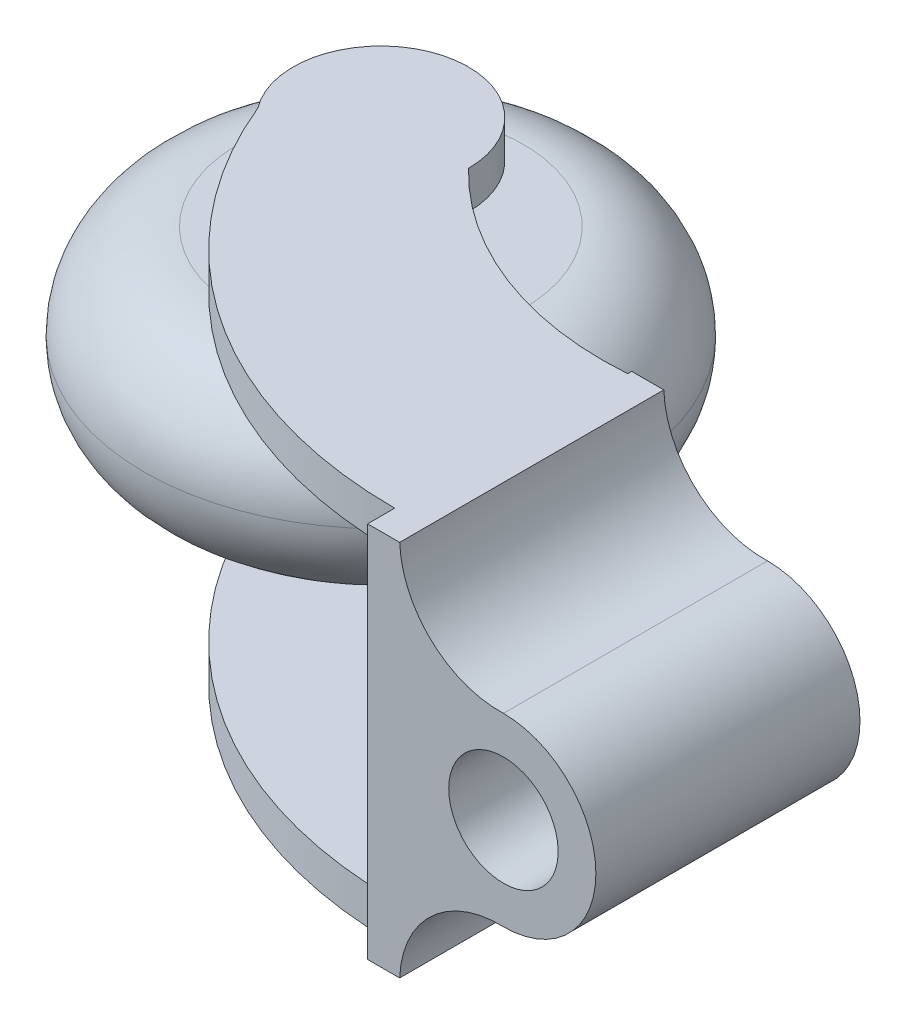
ISO-10303-21;
HEADER;
FILE_DESCRIPTION(('STEP AP214'),'2;1');
FILE_NAME('part.step','',(''),(''),'','','');
FILE_SCHEMA(('AUTOMOTIVE_DESIGN { 1 0 10303 214 1 1 1 1 }'));
ENDSEC;
DATA;
#1=APPLICATION_CONTEXT('core data for automotive mechanical design processes');
#2=APPLICATION_PROTOCOL_DEFINITION('international standard','automotive_design',2000,#1);
#3=PRODUCT_CONTEXT('',#1,'mechanical');
#4=PRODUCT('Part','Part','',(#3));
#5=PRODUCT_RELATED_PRODUCT_CATEGORY('part','',(#4));
#6=PRODUCT_DEFINITION_FORMATION('','',#4);
#7=PRODUCT_DEFINITION_CONTEXT('part definition',#1,'design');
#8=PRODUCT_DEFINITION('design','',#6,#7);
#9=PRODUCT_DEFINITION_SHAPE('','',#8);
#10=(LENGTH_UNIT() NAMED_UNIT(*) SI_UNIT(.MILLI.,.METRE.));
#11=(NAMED_UNIT(*) PLANE_ANGLE_UNIT() SI_UNIT($,.RADIAN.));
#12=(NAMED_UNIT(*) SI_UNIT($,.STERADIAN.) SOLID_ANGLE_UNIT());
#13=UNCERTAINTY_MEASURE_WITH_UNIT(LENGTH_MEASURE(1.E-05),#10,'distance_accuracy_value','');
#14=(GEOMETRIC_REPRESENTATION_CONTEXT(3) GLOBAL_UNCERTAINTY_ASSIGNED_CONTEXT((#13)) GLOBAL_UNIT_ASSIGNED_CONTEXT((#10,
#11,#12)) REPRESENTATION_CONTEXT('',''));
#15=CARTESIAN_POINT('',(0.,0.,0.));
#16=DIRECTION('',(0.,0.,1.));
#17=DIRECTION('',(1.,0.,0.));
#18=AXIS2_PLACEMENT_3D('',#15,#16,#17);
#19=CARTESIAN_POINT('',(0.,15.,0.));
#20=DIRECTION('',(0.,-1.,0.));
#21=DIRECTION('',(0.,0.,-1.));
#22=AXIS2_PLACEMENT_3D('',#19,#20,#21);
#23=CYLINDRICAL_SURFACE('',#22,1.925);
#24=CARTESIAN_POINT('',(0.,0.,0.));
#25=DIRECTION('',(0.,1.,0.));
#26=DIRECTION('',(0.,0.,1.));
#27=AXIS2_PLACEMENT_3D('',#24,#25,#26);
#28=CIRCLE('',#27,1.925);
#29=CARTESIAN_POINT('',(0.,0.,1.925));
#30=VERTEX_POINT('',#29);
#31=EDGE_CURVE('E316',#30,#30,#28,.T.);
#32=ORIENTED_EDGE('',*,*,#31,.F.);
#33=EDGE_LOOP('',(#32));
#34=FACE_BOUND('',#33,.T.);
#35=CARTESIAN_POINT('',(0.,-3.,0.));
#36=DIRECTION('',(0.,-1.,0.));
#37=DIRECTION('',(0.,0.,-1.));
#38=AXIS2_PLACEMENT_3D('',#35,#36,#37);
#39=CIRCLE('',#38,1.925);
#40=CARTESIAN_POINT('',(0.,-3.,-1.925));
#41=VERTEX_POINT('',#40);
#42=EDGE_CURVE('E315',#41,#41,#39,.F.);
#43=ORIENTED_EDGE('',*,*,#42,.T.);
#44=EDGE_LOOP('',(#43));
#45=FACE_BOUND('',#44,.T.);
#46=ADVANCED_FACE('F89',(#34,#45),#23,.T.);
#47=CARTESIAN_POINT('',(0.,10.,0.));
#48=DIRECTION('',(0.,1.,0.));
#49=DIRECTION('',(0.,0.,1.));
#50=AXIS2_PLACEMENT_3D('',#47,#48,#49);
#51=PLANE('',#50);
#52=CARTESIAN_POINT('',(0.,10.,0.));
#53=DIRECTION('',(0.,1.,0.));
#54=DIRECTION('',(0.,0.,1.));
#55=AXIS2_PLACEMENT_3D('',#52,#53,#54);
#56=CIRCLE('',#55,7.55);
#57=CARTESIAN_POINT('',(0.,10.,7.55));
#58=VERTEX_POINT('',#57);
#59=EDGE_CURVE('E97',#58,#58,#56,.T.);
#60=ORIENTED_EDGE('',*,*,#59,.T.);
#61=EDGE_LOOP('',(#60));
#62=FACE_BOUND('',#61,.T.);
#63=CARTESIAN_POINT('',(0.,10.,0.));
#64=DIRECTION('',(0.,1.,0.));
#65=DIRECTION('',(0.,0.,1.));
#66=AXIS2_PLACEMENT_3D('',#63,#64,#65);
#67=CIRCLE('',#66,1.925);
#68=CARTESIAN_POINT('',(0.,10.,1.925));
#69=VERTEX_POINT('',#68);
#70=EDGE_CURVE('E320',#69,#69,#67,.T.);
#71=ORIENTED_EDGE('',*,*,#70,.F.);
#72=EDGE_LOOP('',(#71));
#73=FACE_BOUND('',#72,.T.);
#74=ADVANCED_FACE('F390',(#62,#73),#51,.T.);
#75=CARTESIAN_POINT('',(0.,0.,0.));
#76=DIRECTION('',(0.,1.,0.));
#77=DIRECTION('',(0.,0.,1.));
#78=AXIS2_PLACEMENT_3D('',#75,#76,#77);
#79=PLANE('',#78);
#80=CARTESIAN_POINT('',(0.,0.,0.));
#81=DIRECTION('',(0.,1.,0.));
#82=DIRECTION('',(0.,0.,1.));
#83=AXIS2_PLACEMENT_3D('',#80,#81,#82);
#84=CIRCLE('',#83,7.55);
#85=CARTESIAN_POINT('',(0.,0.,7.55));
#86=VERTEX_POINT('',#85);
#87=EDGE_CURVE('E323',#86,#86,#84,.F.);
#88=ORIENTED_EDGE('',*,*,#87,.T.);
#89=EDGE_LOOP('',(#88));
#90=FACE_BOUND('',#89,.T.);
#91=ORIENTED_EDGE('',*,*,#31,.T.);
#92=EDGE_LOOP('',(#91));
#93=FACE_BOUND('',#92,.T.);
#94=ADVANCED_FACE('F397',(#90,#93),#79,.F.);
#95=CARTESIAN_POINT('',(0.,5.,0.));
#96=DIRECTION('',(0.,1.,0.));
#97=DIRECTION('',(0.,0.,1.));
#98=AXIS2_PLACEMENT_3D('',#95,#96,#97);
#99=TOROIDAL_SURFACE('',#98,7.55,5.);
#100=ORIENTED_EDGE('',*,*,#59,.F.);
#101=EDGE_LOOP('',(#100));
#102=FACE_BOUND('',#101,.T.);
#103=CARTESIAN_POINT('',(0.,5.,0.));
#104=DIRECTION('',(0.,1.,0.));
#105=DIRECTION('',(0.,0.,1.));
#106=AXIS2_PLACEMENT_3D('',#103,#104,#105);
#107=CIRCLE('',#106,12.55);
#108=CARTESIAN_POINT('',(0.,5.,12.55));
#109=VERTEX_POINT('',#108);
#110=EDGE_CURVE('E319',#109,#109,#107,.F.);
#111=ORIENTED_EDGE('',*,*,#110,.F.);
#112=EDGE_LOOP('',(#111));
#113=FACE_BOUND('',#112,.T.);
#114=ADVANCED_FACE('F91',(#102,#113),#99,.T.);
#115=CARTESIAN_POINT('',(0.,5.,0.));
#116=DIRECTION('',(0.,1.,0.));
#117=DIRECTION('',(0.,0.,1.));
#118=AXIS2_PLACEMENT_3D('',#115,#116,#117);
#119=TOROIDAL_SURFACE('',#118,7.55,5.);
#120=ORIENTED_EDGE('',*,*,#87,.F.);
#121=EDGE_LOOP('',(#120));
#122=FACE_BOUND('',#121,.T.);
#123=ORIENTED_EDGE('',*,*,#110,.T.);
#124=EDGE_LOOP('',(#123));
#125=FACE_BOUND('',#124,.T.);
#126=ADVANCED_FACE('F403',(#122,#125),#119,.T.);
#127=CARTESIAN_POINT('',(0.,13.,0.));
#128=DIRECTION('',(0.,-1.,0.));
#129=DIRECTION('',(0.,0.,-1.));
#130=AXIS2_PLACEMENT_3D('',#127,#128,#129);
#131=CIRCLE('',#130,1.925);
#132=CARTESIAN_POINT('',(0.,13.,-1.925));
#133=VERTEX_POINT('',#132);
#134=EDGE_CURVE('E12',#133,#133,#131,.F.);
#135=ORIENTED_EDGE('',*,*,#134,.F.);
#136=EDGE_LOOP('',(#135));
#137=FACE_BOUND('',#136,.T.);
#138=ORIENTED_EDGE('',*,*,#70,.T.);
#139=EDGE_LOOP('',(#138));
#140=FACE_BOUND('',#139,.T.);
#141=ADVANCED_FACE('F393',(#137,#140),#23,.T.);
#142=CARTESIAN_POINT('',(0.,-3.,0.));
#143=DIRECTION('',(0.,-1.,0.));
#144=DIRECTION('',(0.,0.,-1.));
#145=AXIS2_PLACEMENT_3D('',#142,#143,#144);
#146=CYLINDRICAL_SURFACE('',#145,4.65);
#147=CARTESIAN_POINT('',(0.,-5.,0.));
#148=DIRECTION('',(0.,-1.,0.));
#149=DIRECTION('',(0.,0.,-1.));
#150=AXIS2_PLACEMENT_3D('',#147,#148,#149);
#151=CIRCLE('',#150,4.65);
#152=CARTESIAN_POINT('',(-3.69653807580867,-5.,2.82101156575025));
#153=VERTEX_POINT('',#152);
#154=CARTESIAN_POINT('',(4.65,-5.,0.));
#155=VERTEX_POINT('',#154);
#156=EDGE_CURVE('E308',#153,#155,#151,.T.);
#157=ORIENTED_EDGE('',*,*,#156,.F.);
#158=DIRECTION('',(0.,-1.,0.));
#159=VECTOR('',#158,1.);
#160=CARTESIAN_POINT('',(-3.69653807580868,-4.,2.82101156575025));
#161=LINE('',#160,#159);
#162=CARTESIAN_POINT('',(-3.69653807580867,-3.,2.82101156575025));
#163=VERTEX_POINT('',#162);
#164=EDGE_CURVE('E313',#163,#153,#161,.T.);
#165=ORIENTED_EDGE('',*,*,#164,.F.);
#166=CARTESIAN_POINT('',(0.,-3.,0.));
#167=DIRECTION('',(0.,-1.,0.));
#168=DIRECTION('',(0.,0.,-1.));
#169=AXIS2_PLACEMENT_3D('',#166,#167,#168);
#170=CIRCLE('',#169,4.65);
#171=CARTESIAN_POINT('',(4.65,-3.,0.));
#172=VERTEX_POINT('',#171);
#173=EDGE_CURVE('E300',#163,#172,#170,.T.);
#174=ORIENTED_EDGE('',*,*,#173,.T.);
#175=DIRECTION('',(0.,-1.,0.));
#176=VECTOR('',#175,1.);
#177=CARTESIAN_POINT('',(4.65,-3.,0.));
#178=LINE('',#177,#176);
#179=EDGE_CURVE('E306',#172,#155,#178,.T.);
#180=ORIENTED_EDGE('',*,*,#179,.T.);
#181=EDGE_LOOP('',(#157,#165,#174,#180));
#182=FACE_BOUND('',#181,.T.);
#183=ADVANCED_FACE('F346',(#182),#146,.T.);
#184=CARTESIAN_POINT('',(18.2711085103425,-3.,-6.17537570171098));
#185=DIRECTION('',(0.,-1.,0.));
#186=DIRECTION('',(0.,0.,-1.));
#187=AXIS2_PLACEMENT_3D('',#184,#185,#186);
#188=CYLINDRICAL_SURFACE('',#187,23.7384178158566);
#189=CARTESIAN_POINT('',(18.2711085103425,-5.,-6.17537570171098));
#190=DIRECTION('',(0.,-1.,0.));
#191=DIRECTION('',(0.,0.,-1.));
#192=AXIS2_PLACEMENT_3D('',#189,#190,#191);
#193=CIRCLE('',#192,23.7384178158566);
#194=CARTESIAN_POINT('',(18.3,-5.,17.5630245325509));
#195=VERTEX_POINT('',#194);
#196=EDGE_CURVE('E111',#153,#195,#193,.F.);
#197=ORIENTED_EDGE('',*,*,#196,.T.);
#198=DIRECTION('',(0.,-1.,0.));
#199=VECTOR('',#198,1.);
#200=CARTESIAN_POINT('',(18.3,-3.,17.5630245325509));
#201=LINE('',#200,#199);
#202=CARTESIAN_POINT('',(18.3,-3.,17.5630245325509));
#203=VERTEX_POINT('',#202);
#204=EDGE_CURVE('E255',#195,#203,#201,.F.);
#205=ORIENTED_EDGE('',*,*,#204,.T.);
#206=CARTESIAN_POINT('',(18.2711085103425,-3.,-6.17537570171098));
#207=DIRECTION('',(0.,-1.,0.));
#208=DIRECTION('',(0.,0.,-1.));
#209=AXIS2_PLACEMENT_3D('',#206,#207,#208);
#210=CIRCLE('',#209,23.7384178158566);
#211=EDGE_CURVE('E203',#163,#203,#210,.F.);
#212=ORIENTED_EDGE('',*,*,#211,.F.);
#213=ORIENTED_EDGE('',*,*,#164,.T.);
#214=EDGE_LOOP('',(#197,#205,#212,#213));
#215=FACE_BOUND('',#214,.T.);
#216=ADVANCED_FACE('F341',(#215),#188,.T.);
#217=CARTESIAN_POINT('',(17.0198338011086,-3.,-11.9131397694033));
#218=DIRECTION('',(0.,-1.,0.));
#219=DIRECTION('',(0.,0.,-1.));
#220=AXIS2_PLACEMENT_3D('',#217,#218,#219);
#221=CYLINDRICAL_SURFACE('',#220,17.1736917240408);
#222=DIRECTION('',(0.,-1.,0.));
#223=VECTOR('',#222,1.);
#224=CARTESIAN_POINT('',(18.3,-3.,5.2127722336289));
#225=LINE('',#224,#223);
#226=CARTESIAN_POINT('',(18.3,-5.,5.2127722336289));
#227=VERTEX_POINT('',#226);
#228=CARTESIAN_POINT('',(18.3,-3.,5.2127722336289));
#229=VERTEX_POINT('',#228);
#230=EDGE_CURVE('E273',#227,#229,#225,.F.);
#231=ORIENTED_EDGE('',*,*,#230,.F.);
#232=CARTESIAN_POINT('',(17.0198338011086,-5.,-11.9131397694033));
#233=DIRECTION('',(0.,-1.,0.));
#234=DIRECTION('',(0.,0.,-1.));
#235=AXIS2_PLACEMENT_3D('',#232,#233,#234);
#236=CIRCLE('',#235,17.1736917240408);
#237=EDGE_CURVE('E204',#155,#227,#236,.F.);
#238=ORIENTED_EDGE('',*,*,#237,.F.);
#239=ORIENTED_EDGE('',*,*,#179,.F.);
#240=CARTESIAN_POINT('',(17.0198338011086,-3.,-11.9131397694033));
#241=DIRECTION('',(0.,-1.,0.));
#242=DIRECTION('',(0.,0.,-1.));
#243=AXIS2_PLACEMENT_3D('',#240,#241,#242);
#244=CIRCLE('',#243,17.1736917240408);
#245=EDGE_CURVE('E303',#172,#229,#244,.F.);
#246=ORIENTED_EDGE('',*,*,#245,.T.);
#247=EDGE_LOOP('',(#231,#238,#239,#246));
#248=FACE_BOUND('',#247,.T.);
#249=ADVANCED_FACE('F336',(#248),#221,.F.);
#250=CARTESIAN_POINT('',(0.,-3.,0.));
#251=DIRECTION('',(0.,-1.,0.));
#252=DIRECTION('',(0.,0.,-1.));
#253=AXIS2_PLACEMENT_3D('',#250,#251,#252);
#254=PLANE('',#253);
#255=ORIENTED_EDGE('',*,*,#42,.F.);
#256=EDGE_LOOP('',(#255));
#257=FACE_BOUND('',#256,.T.);
#258=ORIENTED_EDGE('',*,*,#211,.T.);
#259=DIRECTION('',(0.,0.,-1.));
#260=VECTOR('',#259,1.);
#261=CARTESIAN_POINT('',(18.3,-3.,0.));
#262=LINE('',#261,#260);
#263=EDGE_CURVE('E104',#203,#229,#262,.T.);
#264=ORIENTED_EDGE('',*,*,#263,.T.);
#265=ORIENTED_EDGE('',*,*,#245,.F.);
#266=ORIENTED_EDGE('',*,*,#173,.F.);
#267=EDGE_LOOP('',(#258,#264,#265,#266));
#268=FACE_BOUND('',#267,.T.);
#269=ADVANCED_FACE('F333',(#257,#268),#254,.F.);
#270=CARTESIAN_POINT('',(0.,-5.,0.));
#271=DIRECTION('',(0.,-1.,0.));
#272=DIRECTION('',(0.,0.,-1.));
#273=AXIS2_PLACEMENT_3D('',#270,#271,#272);
#274=PLANE('',#273);
#275=ORIENTED_EDGE('',*,*,#237,.T.);
#276=DIRECTION('',(0.,0.,-1.));
#277=VECTOR('',#276,1.);
#278=CARTESIAN_POINT('',(18.3,-5.,17.5));
#279=LINE('',#278,#277);
#280=CARTESIAN_POINT('',(18.3,-5.,5.));
#281=VERTEX_POINT('',#280);
#282=EDGE_CURVE('E257',#227,#281,#279,.T.);
#283=ORIENTED_EDGE('',*,*,#282,.T.);
#284=DIRECTION('',(1.,0.,0.));
#285=VECTOR('',#284,1.);
#286=CARTESIAN_POINT('',(18.3,-5.,5.));
#287=LINE('',#286,#285);
#288=CARTESIAN_POINT('',(20.,-5.,5.));
#289=VERTEX_POINT('',#288);
#290=EDGE_CURVE('E199',#281,#289,#287,.T.);
#291=ORIENTED_EDGE('',*,*,#290,.T.);
#292=DIRECTION('',(0.,0.,-1.));
#293=VECTOR('',#292,1.);
#294=CARTESIAN_POINT('',(20.,-5.,0.));
#295=LINE('',#294,#293);
#296=CARTESIAN_POINT('',(20.,-5.,19.));
#297=VERTEX_POINT('',#296);
#298=EDGE_CURVE('E191',#297,#289,#295,.T.);
#299=ORIENTED_EDGE('',*,*,#298,.F.);
#300=DIRECTION('',(-1.,0.,0.));
#301=VECTOR('',#300,1.);
#302=CARTESIAN_POINT('',(0.,-5.,19.));
#303=LINE('',#302,#301);
#304=CARTESIAN_POINT('',(18.3,-5.,19.));
#305=VERTEX_POINT('',#304);
#306=EDGE_CURVE('E197',#297,#305,#303,.T.);
#307=ORIENTED_EDGE('',*,*,#306,.T.);
#308=DIRECTION('',(0.,0.,-1.));
#309=VECTOR('',#308,1.);
#310=CARTESIAN_POINT('',(18.3,-5.,19.));
#311=LINE('',#310,#309);
#312=EDGE_CURVE('E235',#305,#195,#311,.T.);
#313=ORIENTED_EDGE('',*,*,#312,.T.);
#314=ORIENTED_EDGE('',*,*,#196,.F.);
#315=ORIENTED_EDGE('',*,*,#156,.T.);
#316=EDGE_LOOP('',(#275,#283,#291,#299,#307,#313,#314,#315));
#317=FACE_BOUND('',#316,.T.);
#318=ADVANCED_FACE('F194',(#317),#274,.T.);
#319=CARTESIAN_POINT('',(0.,13.,0.));
#320=DIRECTION('',(0.,1.,0.));
#321=DIRECTION('',(0.,0.,1.));
#322=AXIS2_PLACEMENT_3D('',#319,#320,#321);
#323=CYLINDRICAL_SURFACE('',#322,4.65);
#324=CARTESIAN_POINT('',(0.,15.,0.));
#325=DIRECTION('',(0.,-1.,0.));
#326=DIRECTION('',(0.,0.,-1.));
#327=AXIS2_PLACEMENT_3D('',#324,#325,#326);
#328=CIRCLE('',#327,4.65);
#329=CARTESIAN_POINT('',(-3.69653807580867,15.,2.82101156575025));
#330=VERTEX_POINT('',#329);
#331=CARTESIAN_POINT('',(4.65,15.,0.));
#332=VERTEX_POINT('',#331);
#333=EDGE_CURVE('E289',#330,#332,#328,.T.);
#334=ORIENTED_EDGE('',*,*,#333,.T.);
#335=DIRECTION('',(0.,1.,0.));
#336=VECTOR('',#335,1.);
#337=CARTESIAN_POINT('',(4.65,13.,0.));
#338=LINE('',#337,#336);
#339=CARTESIAN_POINT('',(4.65,13.,0.));
#340=VERTEX_POINT('',#339);
#341=EDGE_CURVE('E284',#340,#332,#338,.T.);
#342=ORIENTED_EDGE('',*,*,#341,.F.);
#343=CARTESIAN_POINT('',(0.,13.,0.));
#344=DIRECTION('',(0.,-1.,0.));
#345=DIRECTION('',(0.,0.,-1.));
#346=AXIS2_PLACEMENT_3D('',#343,#344,#345);
#347=CIRCLE('',#346,4.65);
#348=CARTESIAN_POINT('',(-3.69653807580867,13.,2.82101156575025));
#349=VERTEX_POINT('',#348);
#350=EDGE_CURVE('E278',#349,#340,#347,.T.);
#351=ORIENTED_EDGE('',*,*,#350,.F.);
#352=DIRECTION('',(0.,1.,0.));
#353=VECTOR('',#352,1.);
#354=CARTESIAN_POINT('',(-3.69653807580868,14.,2.82101156575025));
#355=LINE('',#354,#353);
#356=EDGE_CURVE('E295',#349,#330,#355,.T.);
#357=ORIENTED_EDGE('',*,*,#356,.T.);
#358=EDGE_LOOP('',(#334,#342,#351,#357));
#359=FACE_BOUND('',#358,.T.);
#360=ADVANCED_FACE('F376',(#359),#323,.T.);
#361=CARTESIAN_POINT('',(18.2711085103425,13.,-6.17537570171098));
#362=DIRECTION('',(0.,1.,0.));
#363=DIRECTION('',(0.,0.,1.));
#364=AXIS2_PLACEMENT_3D('',#361,#362,#363);
#365=CYLINDRICAL_SURFACE('',#364,23.7384178158566);
#366=CARTESIAN_POINT('',(18.2711085103425,13.,-6.17537570171098));
#367=DIRECTION('',(0.,-1.,0.));
#368=DIRECTION('',(0.,0.,-1.));
#369=AXIS2_PLACEMENT_3D('',#366,#367,#368);
#370=CIRCLE('',#369,23.7384178158566);
#371=CARTESIAN_POINT('',(18.3,13.,17.5630245325509));
#372=VERTEX_POINT('',#371);
#373=EDGE_CURVE('E282',#372,#349,#370,.T.);
#374=ORIENTED_EDGE('',*,*,#373,.F.);
#375=DIRECTION('',(0.,1.,0.));
#376=VECTOR('',#375,1.);
#377=CARTESIAN_POINT('',(18.3,13.,17.5630245325509));
#378=LINE('',#377,#376);
#379=CARTESIAN_POINT('',(18.3,15.,17.5630245325509));
#380=VERTEX_POINT('',#379);
#381=EDGE_CURVE('E247',#372,#380,#378,.T.);
#382=ORIENTED_EDGE('',*,*,#381,.T.);
#383=CARTESIAN_POINT('',(18.2711085103425,15.,-6.17537570171098));
#384=DIRECTION('',(0.,-1.,0.));
#385=DIRECTION('',(0.,0.,-1.));
#386=AXIS2_PLACEMENT_3D('',#383,#384,#385);
#387=CIRCLE('',#386,23.7384178158566);
#388=EDGE_CURVE('E279',#380,#330,#387,.T.);
#389=ORIENTED_EDGE('',*,*,#388,.T.);
#390=ORIENTED_EDGE('',*,*,#356,.F.);
#391=EDGE_LOOP('',(#374,#382,#389,#390));
#392=FACE_BOUND('',#391,.T.);
#393=ADVANCED_FACE('F367',(#392),#365,.T.);
#394=CARTESIAN_POINT('',(17.0198338011086,13.,-11.9131397694033));
#395=DIRECTION('',(0.,1.,0.));
#396=DIRECTION('',(0.,0.,1.));
#397=AXIS2_PLACEMENT_3D('',#394,#395,#396);
#398=CYLINDRICAL_SURFACE('',#397,17.1736917240408);
#399=DIRECTION('',(0.,1.,0.));
#400=VECTOR('',#399,1.);
#401=CARTESIAN_POINT('',(18.3,13.,5.2127722336289));
#402=LINE('',#401,#400);
#403=CARTESIAN_POINT('',(18.3,13.,5.2127722336289));
#404=VERTEX_POINT('',#403);
#405=CARTESIAN_POINT('',(18.3,15.,5.2127722336289));
#406=VERTEX_POINT('',#405);
#407=EDGE_CURVE('E270',#404,#406,#402,.T.);
#408=ORIENTED_EDGE('',*,*,#407,.F.);
#409=CARTESIAN_POINT('',(17.0198338011086,13.,-11.9131397694033));
#410=DIRECTION('',(0.,-1.,0.));
#411=DIRECTION('',(0.,0.,-1.));
#412=AXIS2_PLACEMENT_3D('',#409,#410,#411);
#413=CIRCLE('',#412,17.1736917240408);
#414=EDGE_CURVE('E276',#404,#340,#413,.T.);
#415=ORIENTED_EDGE('',*,*,#414,.T.);
#416=ORIENTED_EDGE('',*,*,#341,.T.);
#417=CARTESIAN_POINT('',(17.0198338011086,15.,-11.9131397694033));
#418=DIRECTION('',(0.,-1.,0.));
#419=DIRECTION('',(0.,0.,-1.));
#420=AXIS2_PLACEMENT_3D('',#417,#418,#419);
#421=CIRCLE('',#420,17.1736917240408);
#422=EDGE_CURVE('E287',#406,#332,#421,.T.);
#423=ORIENTED_EDGE('',*,*,#422,.F.);
#424=EDGE_LOOP('',(#408,#415,#416,#423));
#425=FACE_BOUND('',#424,.T.);
#426=ADVANCED_FACE('F379',(#425),#398,.F.);
#427=CARTESIAN_POINT('',(17.0198338011086,13.,-11.9131397694033));
#428=DIRECTION('',(0.,-1.,0.));
#429=DIRECTION('',(0.,0.,-1.));
#430=AXIS2_PLACEMENT_3D('',#427,#428,#429);
#431=PLANE('',#430);
#432=DIRECTION('',(0.,0.,-1.));
#433=VECTOR('',#432,1.);
#434=CARTESIAN_POINT('',(18.3,13.,-11.9131397694033));
#435=LINE('',#434,#433);
#436=EDGE_CURVE('E267',#372,#404,#435,.T.);
#437=ORIENTED_EDGE('',*,*,#436,.F.);
#438=ORIENTED_EDGE('',*,*,#373,.T.);
#439=ORIENTED_EDGE('',*,*,#350,.T.);
#440=ORIENTED_EDGE('',*,*,#414,.F.);
#441=EDGE_LOOP('',(#437,#438,#439,#440));
#442=FACE_BOUND('',#441,.T.);
#443=ORIENTED_EDGE('',*,*,#134,.T.);
#444=EDGE_LOOP('',(#443));
#445=FACE_BOUND('',#444,.T.);
#446=ADVANCED_FACE('F371',(#442,#445),#431,.T.);
#447=CARTESIAN_POINT('',(0.,15.,0.));
#448=DIRECTION('',(0.,-1.,0.));
#449=DIRECTION('',(0.,0.,-1.));
#450=AXIS2_PLACEMENT_3D('',#447,#448,#449);
#451=PLANE('',#450);
#452=ORIENTED_EDGE('',*,*,#388,.F.);
#453=DIRECTION('',(0.,0.,-1.));
#454=VECTOR('',#453,1.);
#455=CARTESIAN_POINT('',(18.3,15.,19.));
#456=LINE('',#455,#454);
#457=CARTESIAN_POINT('',(18.3,15.,19.));
#458=VERTEX_POINT('',#457);
#459=EDGE_CURVE('E250',#458,#380,#456,.T.);
#460=ORIENTED_EDGE('',*,*,#459,.F.);
#461=DIRECTION('',(1.,0.,0.));
#462=VECTOR('',#461,1.);
#463=CARTESIAN_POINT('',(0.,15.,19.));
#464=LINE('',#463,#462);
#465=CARTESIAN_POINT('',(20.,15.,19.));
#466=VERTEX_POINT('',#465);
#467=EDGE_CURVE('E222',#458,#466,#464,.T.);
#468=ORIENTED_EDGE('',*,*,#467,.T.);
#469=DIRECTION('',(0.,0.,-1.));
#470=VECTOR('',#469,1.);
#471=CARTESIAN_POINT('',(20.,15.,0.));
#472=LINE('',#471,#470);
#473=CARTESIAN_POINT('',(20.,15.,5.));
#474=VERTEX_POINT('',#473);
#475=EDGE_CURVE('E275',#466,#474,#472,.T.);
#476=ORIENTED_EDGE('',*,*,#475,.T.);
#477=DIRECTION('',(1.,0.,0.));
#478=VECTOR('',#477,1.);
#479=CARTESIAN_POINT('',(18.3,15.,5.));
#480=LINE('',#479,#478);
#481=CARTESIAN_POINT('',(18.3,15.,5.));
#482=VERTEX_POINT('',#481);
#483=EDGE_CURVE('E265',#482,#474,#480,.T.);
#484=ORIENTED_EDGE('',*,*,#483,.F.);
#485=DIRECTION('',(0.,0.,1.));
#486=VECTOR('',#485,1.);
#487=CARTESIAN_POINT('',(18.3,15.,17.5));
#488=LINE('',#487,#486);
#489=EDGE_CURVE('E262',#482,#406,#488,.T.);
#490=ORIENTED_EDGE('',*,*,#489,.T.);
#491=ORIENTED_EDGE('',*,*,#422,.T.);
#492=ORIENTED_EDGE('',*,*,#333,.F.);
#493=EDGE_LOOP('',(#452,#460,#468,#476,#484,#490,#491,#492));
#494=FACE_BOUND('',#493,.T.);
#495=ADVANCED_FACE('F361',(#494),#451,.F.);
#496=CARTESIAN_POINT('',(18.3,-5.,5.));
#497=DIRECTION('',(0.,0.,-1.));
#498=DIRECTION('',(-1.,0.,0.));
#499=AXIS2_PLACEMENT_3D('',#496,#497,#498);
#500=PLANE('',#499);
#501=ORIENTED_EDGE('',*,*,#483,.T.);
#502=CARTESIAN_POINT('',(25.3,15.2,5.));
#503=DIRECTION('',(0.,0.,-1.));
#504=DIRECTION('',(-1.,0.,0.));
#505=AXIS2_PLACEMENT_3D('',#502,#503,#504);
#506=CIRCLE('',#505,5.30377224247046);
#507=CARTESIAN_POINT('',(25.5,9.9,5.));
#508=VERTEX_POINT('',#507);
#509=EDGE_CURVE('E238',#474,#508,#506,.F.);
#510=ORIENTED_EDGE('',*,*,#509,.T.);
#511=CARTESIAN_POINT('',(25.5,5.,5.));
#512=DIRECTION('',(0.,0.,-1.));
#513=DIRECTION('',(-1.,0.,0.));
#514=AXIS2_PLACEMENT_3D('',#511,#512,#513);
#515=CIRCLE('',#514,4.9);
#516=CARTESIAN_POINT('',(25.4999999999999,0.0999999999999951,5.));
#517=VERTEX_POINT('',#516);
#518=EDGE_CURVE('E241',#508,#517,#515,.T.);
#519=ORIENTED_EDGE('',*,*,#518,.T.);
#520=CARTESIAN_POINT('',(25.3,-5.20000000000002,5.));
#521=DIRECTION('',(0.,0.,-1.));
#522=DIRECTION('',(-1.,0.,0.));
#523=AXIS2_PLACEMENT_3D('',#520,#521,#522);
#524=CIRCLE('',#523,5.30377224247046);
#525=EDGE_CURVE('E236',#289,#517,#524,.T.);
#526=ORIENTED_EDGE('',*,*,#525,.F.);
#527=ORIENTED_EDGE('',*,*,#290,.F.);
#528=DIRECTION('',(0.,1.,0.));
#529=VECTOR('',#528,1.);
#530=CARTESIAN_POINT('',(18.3,-5.,5.));
#531=LINE('',#530,#529);
#532=EDGE_CURVE('E259',#281,#482,#531,.T.);
#533=ORIENTED_EDGE('',*,*,#532,.T.);
#534=EDGE_LOOP('',(#501,#510,#519,#526,#527,#533));
#535=FACE_BOUND('',#534,.T.);
#536=CARTESIAN_POINT('',(25.5,5.,5.));
#537=DIRECTION('',(0.,0.,-1.));
#538=DIRECTION('',(-1.,0.,0.));
#539=AXIS2_PLACEMENT_3D('',#536,#537,#538);
#540=CIRCLE('',#539,2.9);
#541=CARTESIAN_POINT('',(22.6,5.,5.));
#542=VERTEX_POINT('',#541);
#543=EDGE_CURVE('E213',#542,#542,#540,.T.);
#544=ORIENTED_EDGE('',*,*,#543,.F.);
#545=EDGE_LOOP('',(#544));
#546=FACE_BOUND('',#545,.T.);
#547=ADVANCED_FACE('F351',(#535,#546),#500,.T.);
#548=CARTESIAN_POINT('',(18.3,0.,0.));
#549=DIRECTION('',(-1.,0.,0.));
#550=DIRECTION('',(0.,0.,1.));
#551=AXIS2_PLACEMENT_3D('',#548,#549,#550);
#552=PLANE('',#551);
#553=ORIENTED_EDGE('',*,*,#282,.F.);
#554=ORIENTED_EDGE('',*,*,#230,.T.);
#555=ORIENTED_EDGE('',*,*,#263,.F.);
#556=ORIENTED_EDGE('',*,*,#204,.F.);
#557=ORIENTED_EDGE('',*,*,#312,.F.);
#558=DIRECTION('',(0.,1.,0.));
#559=VECTOR('',#558,1.);
#560=CARTESIAN_POINT('',(18.3,0.,19.));
#561=LINE('',#560,#559);
#562=EDGE_CURVE('E220',#305,#458,#561,.T.);
#563=ORIENTED_EDGE('',*,*,#562,.T.);
#564=ORIENTED_EDGE('',*,*,#459,.T.);
#565=ORIENTED_EDGE('',*,*,#381,.F.);
#566=ORIENTED_EDGE('',*,*,#436,.T.);
#567=ORIENTED_EDGE('',*,*,#407,.T.);
#568=ORIENTED_EDGE('',*,*,#489,.F.);
#569=ORIENTED_EDGE('',*,*,#532,.F.);
#570=EDGE_LOOP('',(#553,#554,#555,#556,#557,#563,#564,#565,#566,#567,#568,#569));
#571=FACE_BOUND('',#570,.T.);
#572=ADVANCED_FACE('F343',(#571),#552,.T.);
#573=CARTESIAN_POINT('',(25.3,-5.20000000000002,19.));
#574=DIRECTION('',(0.,0.,-1.));
#575=DIRECTION('',(-1.,0.,0.));
#576=AXIS2_PLACEMENT_3D('',#573,#574,#575);
#577=CYLINDRICAL_SURFACE('',#576,5.30377224247046);
#578=ORIENTED_EDGE('',*,*,#525,.T.);
#579=DIRECTION('',(0.,0.,-1.));
#580=VECTOR('',#579,1.);
#581=CARTESIAN_POINT('',(25.5,0.0999999999999951,19.));
#582=LINE('',#581,#580);
#583=CARTESIAN_POINT('',(25.5,0.0999999999999951,19.));
#584=VERTEX_POINT('',#583);
#585=EDGE_CURVE('E209',#584,#517,#582,.T.);
#586=ORIENTED_EDGE('',*,*,#585,.F.);
#587=CARTESIAN_POINT('',(25.3,-5.20000000000002,19.));
#588=DIRECTION('',(0.,0.,-1.));
#589=DIRECTION('',(-1.,0.,0.));
#590=AXIS2_PLACEMENT_3D('',#587,#588,#589);
#591=CIRCLE('',#590,5.30377224247046);
#592=EDGE_CURVE('E207',#297,#584,#591,.T.);
#593=ORIENTED_EDGE('',*,*,#592,.F.);
#594=ORIENTED_EDGE('',*,*,#298,.T.);
#595=EDGE_LOOP('',(#578,#586,#593,#594));
#596=FACE_BOUND('',#595,.T.);
#597=ADVANCED_FACE('F208',(#596),#577,.F.);
#598=CARTESIAN_POINT('',(25.5,5.,19.));
#599=DIRECTION('',(0.,0.,-1.));
#600=DIRECTION('',(-1.,0.,0.));
#601=AXIS2_PLACEMENT_3D('',#598,#599,#600);
#602=CYLINDRICAL_SURFACE('',#601,4.9);
#603=ORIENTED_EDGE('',*,*,#518,.F.);
#604=DIRECTION('',(0.,0.,-1.));
#605=VECTOR('',#604,1.);
#606=CARTESIAN_POINT('',(25.5,9.9,19.));
#607=LINE('',#606,#605);
#608=CARTESIAN_POINT('',(25.5,9.9,19.));
#609=VERTEX_POINT('',#608);
#610=EDGE_CURVE('E248',#609,#508,#607,.T.);
#611=ORIENTED_EDGE('',*,*,#610,.F.);
#612=CARTESIAN_POINT('',(25.5,5.,19.));
#613=DIRECTION('',(0.,0.,-1.));
#614=DIRECTION('',(-1.,0.,0.));
#615=AXIS2_PLACEMENT_3D('',#612,#613,#614);
#616=CIRCLE('',#615,4.9);
#617=EDGE_CURVE('E230',#609,#584,#616,.T.);
#618=ORIENTED_EDGE('',*,*,#617,.T.);
#619=ORIENTED_EDGE('',*,*,#585,.T.);
#620=EDGE_LOOP('',(#603,#611,#618,#619));
#621=FACE_BOUND('',#620,.T.);
#622=ADVANCED_FACE('F356',(#621),#602,.T.);
#623=CARTESIAN_POINT('',(25.3,15.2,19.));
#624=DIRECTION('',(0.,0.,-1.));
#625=DIRECTION('',(-1.,0.,0.));
#626=AXIS2_PLACEMENT_3D('',#623,#624,#625);
#627=CYLINDRICAL_SURFACE('',#626,5.30377224247046);
#628=ORIENTED_EDGE('',*,*,#509,.F.);
#629=ORIENTED_EDGE('',*,*,#475,.F.);
#630=CARTESIAN_POINT('',(25.3,15.2,19.));
#631=DIRECTION('',(0.,0.,-1.));
#632=DIRECTION('',(-1.,0.,0.));
#633=AXIS2_PLACEMENT_3D('',#630,#631,#632);
#634=CIRCLE('',#633,5.30377224247046);
#635=EDGE_CURVE('E227',#466,#609,#634,.F.);
#636=ORIENTED_EDGE('',*,*,#635,.T.);
#637=ORIENTED_EDGE('',*,*,#610,.T.);
#638=EDGE_LOOP('',(#628,#629,#636,#637));
#639=FACE_BOUND('',#638,.T.);
#640=ADVANCED_FACE('F563',(#639),#627,.F.);
#641=CARTESIAN_POINT('',(25.5,5.,19.));
#642=DIRECTION('',(0.,0.,-1.));
#643=DIRECTION('',(-1.,0.,0.));
#644=AXIS2_PLACEMENT_3D('',#641,#642,#643);
#645=CYLINDRICAL_SURFACE('',#644,2.9);
#646=CARTESIAN_POINT('',(25.5,5.,19.));
#647=DIRECTION('',(0.,0.,-1.));
#648=DIRECTION('',(-1.,0.,0.));
#649=AXIS2_PLACEMENT_3D('',#646,#647,#648);
#650=CIRCLE('',#649,2.9);
#651=CARTESIAN_POINT('',(22.6,5.,19.));
#652=VERTEX_POINT('',#651);
#653=EDGE_CURVE('E232',#652,#652,#650,.T.);
#654=ORIENTED_EDGE('',*,*,#653,.F.);
#655=EDGE_LOOP('',(#654));
#656=FACE_BOUND('',#655,.T.);
#657=ORIENTED_EDGE('',*,*,#543,.T.);
#658=EDGE_LOOP('',(#657));
#659=FACE_BOUND('',#658,.T.);
#660=ADVANCED_FACE('F572',(#656,#659),#645,.F.);
#661=CARTESIAN_POINT('',(0.,0.,19.));
#662=DIRECTION('',(0.,0.,-1.));
#663=DIRECTION('',(-1.,0.,0.));
#664=AXIS2_PLACEMENT_3D('',#661,#662,#663);
#665=PLANE('',#664);
#666=ORIENTED_EDGE('',*,*,#592,.T.);
#667=ORIENTED_EDGE('',*,*,#617,.F.);
#668=ORIENTED_EDGE('',*,*,#635,.F.);
#669=ORIENTED_EDGE('',*,*,#467,.F.);
#670=ORIENTED_EDGE('',*,*,#562,.F.);
#671=ORIENTED_EDGE('',*,*,#306,.F.);
#672=EDGE_LOOP('',(#666,#667,#668,#669,#670,#671));
#673=FACE_BOUND('',#672,.T.);
#674=ORIENTED_EDGE('',*,*,#653,.T.);
#675=EDGE_LOOP('',(#674));
#676=FACE_BOUND('',#675,.T.);
#677=ADVANCED_FACE('F216',(#673,#676),#665,.F.);
#678=CLOSED_SHELL('',(#46,#74,#94,#114,#126,#141,#183,#216,#249,#269,#318,#360,#393,#426,#446,
#495,#547,#572,#597,#622,#640,#660,#677));
#679=MANIFOLD_SOLID_BREP('B2',#678);
#680=ADVANCED_BREP_SHAPE_REPRESENTATION('',(#18,#679),#14);
#681=SHAPE_DEFINITION_REPRESENTATION(#9,#680);
ENDSEC;
END-ISO-10303-21;
